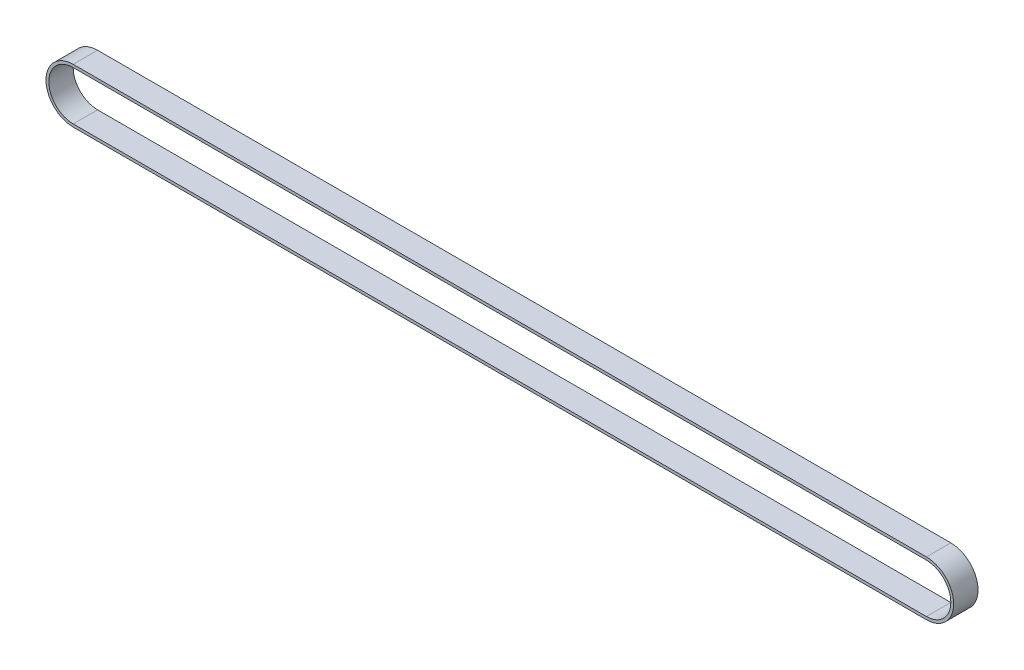
ISO-10303-21;
HEADER;
FILE_DESCRIPTION(('STEP AP214'),'2;1');
FILE_NAME('part.step','',(''),(''),'','','');
FILE_SCHEMA(('AUTOMOTIVE_DESIGN { 1 0 10303 214 1 1 1 1 }'));
ENDSEC;
DATA;
#1=APPLICATION_CONTEXT('core data for automotive mechanical design processes');
#2=APPLICATION_PROTOCOL_DEFINITION('international standard','automotive_design',2000,#1);
#3=PRODUCT_CONTEXT('',#1,'mechanical');
#4=PRODUCT('Part','Part','',(#3));
#5=PRODUCT_RELATED_PRODUCT_CATEGORY('part','',(#4));
#6=PRODUCT_DEFINITION_FORMATION('','',#4);
#7=PRODUCT_DEFINITION_CONTEXT('part definition',#1,'design');
#8=PRODUCT_DEFINITION('design','',#6,#7);
#9=PRODUCT_DEFINITION_SHAPE('','',#8);
#10=(LENGTH_UNIT() NAMED_UNIT(*) SI_UNIT(.MILLI.,.METRE.));
#11=(NAMED_UNIT(*) PLANE_ANGLE_UNIT() SI_UNIT($,.RADIAN.));
#12=(NAMED_UNIT(*) SI_UNIT($,.STERADIAN.) SOLID_ANGLE_UNIT());
#13=UNCERTAINTY_MEASURE_WITH_UNIT(LENGTH_MEASURE(1.E-05),#10,'distance_accuracy_value','');
#14=(GEOMETRIC_REPRESENTATION_CONTEXT(3) GLOBAL_UNCERTAINTY_ASSIGNED_CONTEXT((#13)) GLOBAL_UNIT_ASSIGNED_CONTEXT((#10,
#11,#12)) REPRESENTATION_CONTEXT('',''));
#15=CARTESIAN_POINT('',(0.,0.,0.));
#16=DIRECTION('',(0.,0.,1.));
#17=DIRECTION('',(1.,0.,0.));
#18=AXIS2_PLACEMENT_3D('',#15,#16,#17);
#19=CARTESIAN_POINT('',(0.,0.,40.));
#20=DIRECTION('',(0.,0.,1.));
#21=DIRECTION('',(1.,0.,0.));
#22=AXIS2_PLACEMENT_3D('',#19,#20,#21);
#23=PLANE('',#22);
#24=CARTESIAN_POINT('',(0.,0.,40.));
#25=DIRECTION('',(0.,0.,1.));
#26=DIRECTION('',(1.,0.,0.));
#27=AXIS2_PLACEMENT_3D('',#24,#25,#26);
#28=CIRCLE('',#27,44.6549999999999);
#29=CARTESIAN_POINT('',(0.,44.6549999999998,40.));
#30=VERTEX_POINT('',#29);
#31=CARTESIAN_POINT('',(0.,-44.655,40.));
#32=VERTEX_POINT('',#31);
#33=EDGE_CURVE('E133',#30,#32,#28,.T.);
#34=ORIENTED_EDGE('',*,*,#33,.T.);
#35=DIRECTION('',(1.,0.,0.));
#36=VECTOR('',#35,1.);
#37=CARTESIAN_POINT('',(0.,-44.655,40.));
#38=LINE('',#37,#36);
#39=CARTESIAN_POINT('',(1400.,-44.655,40.));
#40=VERTEX_POINT('',#39);
#41=EDGE_CURVE('E136',#32,#40,#38,.T.);
#42=ORIENTED_EDGE('',*,*,#41,.T.);
#43=CARTESIAN_POINT('',(1400.,0.,40.));
#44=DIRECTION('',(0.,0.,1.));
#45=DIRECTION('',(1.,0.,0.));
#46=AXIS2_PLACEMENT_3D('',#43,#44,#45);
#47=CIRCLE('',#46,44.655);
#48=CARTESIAN_POINT('',(1400.,44.655,40.));
#49=VERTEX_POINT('',#48);
#50=EDGE_CURVE('E139',#40,#49,#47,.T.);
#51=ORIENTED_EDGE('',*,*,#50,.T.);
#52=DIRECTION('',(-1.,0.,0.));
#53=VECTOR('',#52,1.);
#54=CARTESIAN_POINT('',(1400.,44.655,40.));
#55=LINE('',#54,#53);
#56=EDGE_CURVE('E141',#49,#30,#55,.T.);
#57=ORIENTED_EDGE('',*,*,#56,.T.);
#58=EDGE_LOOP('',(#34,#42,#51,#57));
#59=FACE_BOUND('',#58,.T.);
#60=DIRECTION('',(-1.,0.,0.));
#61=VECTOR('',#60,1.);
#62=CARTESIAN_POINT('',(0.,40.055,40.));
#63=LINE('',#62,#61);
#64=CARTESIAN_POINT('',(1400.,40.055,40.));
#65=VERTEX_POINT('',#64);
#66=CARTESIAN_POINT('',(0.,40.055,40.));
#67=VERTEX_POINT('',#66);
#68=EDGE_CURVE('E105',#65,#67,#63,.T.);
#69=ORIENTED_EDGE('',*,*,#68,.F.);
#70=CARTESIAN_POINT('',(1400.,0.,40.));
#71=DIRECTION('',(0.,0.,1.));
#72=DIRECTION('',(-1.,0.,0.));
#73=AXIS2_PLACEMENT_3D('',#70,#71,#72);
#74=CIRCLE('',#73,40.0549999999999);
#75=CARTESIAN_POINT('',(1400.,-40.0549999999998,40.));
#76=VERTEX_POINT('',#75);
#77=EDGE_CURVE('E97',#76,#65,#74,.T.);
#78=ORIENTED_EDGE('',*,*,#77,.F.);
#79=DIRECTION('',(1.,0.,0.));
#80=VECTOR('',#79,1.);
#81=CARTESIAN_POINT('',(1400.,-40.0549999999998,40.));
#82=LINE('',#81,#80);
#83=CARTESIAN_POINT('',(0.,-40.055,40.));
#84=VERTEX_POINT('',#83);
#85=EDGE_CURVE('E119',#84,#76,#82,.T.);
#86=ORIENTED_EDGE('',*,*,#85,.F.);
#87=CARTESIAN_POINT('',(0.,0.,40.));
#88=DIRECTION('',(0.,0.,1.));
#89=DIRECTION('',(-1.,0.,0.));
#90=AXIS2_PLACEMENT_3D('',#87,#88,#89);
#91=CIRCLE('',#90,40.055);
#92=EDGE_CURVE('E117',#67,#84,#91,.T.);
#93=ORIENTED_EDGE('',*,*,#92,.F.);
#94=EDGE_LOOP('',(#69,#78,#86,#93));
#95=FACE_BOUND('',#94,.T.);
#96=ADVANCED_FACE('F32',(#59,#95),#23,.T.);
#97=CARTESIAN_POINT('',(0.,0.,0.));
#98=DIRECTION('',(0.,0.,1.));
#99=DIRECTION('',(1.,0.,0.));
#100=AXIS2_PLACEMENT_3D('',#97,#98,#99);
#101=PLANE('',#100);
#102=CARTESIAN_POINT('',(0.,0.,0.));
#103=DIRECTION('',(0.,0.,1.));
#104=DIRECTION('',(1.,0.,0.));
#105=AXIS2_PLACEMENT_3D('',#102,#103,#104);
#106=CIRCLE('',#105,44.6549999999999);
#107=CARTESIAN_POINT('',(0.,44.6549999999998,0.));
#108=VERTEX_POINT('',#107);
#109=CARTESIAN_POINT('',(0.,-44.655,0.));
#110=VERTEX_POINT('',#109);
#111=EDGE_CURVE('E113',#108,#110,#106,.T.);
#112=ORIENTED_EDGE('',*,*,#111,.F.);
#113=DIRECTION('',(-1.,0.,0.));
#114=VECTOR('',#113,1.);
#115=CARTESIAN_POINT('',(1400.,44.655,0.));
#116=LINE('',#115,#114);
#117=CARTESIAN_POINT('',(1400.,44.655,0.));
#118=VERTEX_POINT('',#117);
#119=EDGE_CURVE('E137',#118,#108,#116,.T.);
#120=ORIENTED_EDGE('',*,*,#119,.F.);
#121=CARTESIAN_POINT('',(1400.,0.,0.));
#122=DIRECTION('',(0.,0.,1.));
#123=DIRECTION('',(1.,0.,0.));
#124=AXIS2_PLACEMENT_3D('',#121,#122,#123);
#125=CIRCLE('',#124,44.655);
#126=CARTESIAN_POINT('',(1400.,-44.655,0.));
#127=VERTEX_POINT('',#126);
#128=EDGE_CURVE('E148',#127,#118,#125,.T.);
#129=ORIENTED_EDGE('',*,*,#128,.F.);
#130=DIRECTION('',(1.,0.,0.));
#131=VECTOR('',#130,1.);
#132=CARTESIAN_POINT('',(0.,-44.655,0.));
#133=LINE('',#132,#131);
#134=EDGE_CURVE('E146',#110,#127,#133,.T.);
#135=ORIENTED_EDGE('',*,*,#134,.F.);
#136=EDGE_LOOP('',(#112,#120,#129,#135));
#137=FACE_BOUND('',#136,.T.);
#138=CARTESIAN_POINT('',(1400.,0.,0.));
#139=DIRECTION('',(0.,0.,1.));
#140=DIRECTION('',(-1.,0.,0.));
#141=AXIS2_PLACEMENT_3D('',#138,#139,#140);
#142=CIRCLE('',#141,40.0549999999999);
#143=CARTESIAN_POINT('',(1400.,-40.0549999999998,0.));
#144=VERTEX_POINT('',#143);
#145=CARTESIAN_POINT('',(1400.,40.055,0.));
#146=VERTEX_POINT('',#145);
#147=EDGE_CURVE('E55',#144,#146,#142,.T.);
#148=ORIENTED_EDGE('',*,*,#147,.T.);
#149=DIRECTION('',(-1.,0.,0.));
#150=VECTOR('',#149,1.);
#151=CARTESIAN_POINT('',(0.,40.055,0.));
#152=LINE('',#151,#150);
#153=CARTESIAN_POINT('',(0.,40.055,0.));
#154=VERTEX_POINT('',#153);
#155=EDGE_CURVE('E112',#146,#154,#152,.T.);
#156=ORIENTED_EDGE('',*,*,#155,.T.);
#157=CARTESIAN_POINT('',(0.,0.,0.));
#158=DIRECTION('',(0.,0.,1.));
#159=DIRECTION('',(-1.,0.,0.));
#160=AXIS2_PLACEMENT_3D('',#157,#158,#159);
#161=CIRCLE('',#160,40.055);
#162=CARTESIAN_POINT('',(0.,-40.055,0.));
#163=VERTEX_POINT('',#162);
#164=EDGE_CURVE('E125',#154,#163,#161,.T.);
#165=ORIENTED_EDGE('',*,*,#164,.T.);
#166=DIRECTION('',(1.,0.,0.));
#167=VECTOR('',#166,1.);
#168=CARTESIAN_POINT('',(1400.,-40.0549999999998,0.));
#169=LINE('',#168,#167);
#170=EDGE_CURVE('E106',#163,#144,#169,.T.);
#171=ORIENTED_EDGE('',*,*,#170,.T.);
#172=EDGE_LOOP('',(#148,#156,#165,#171));
#173=FACE_BOUND('',#172,.T.);
#174=ADVANCED_FACE('F166',(#137,#173),#101,.F.);
#175=CARTESIAN_POINT('',(0.,0.,40.));
#176=DIRECTION('',(0.,0.,-1.));
#177=DIRECTION('',(-1.,0.,0.));
#178=AXIS2_PLACEMENT_3D('',#175,#176,#177);
#179=CYLINDRICAL_SURFACE('',#178,44.6549999999999);
#180=ORIENTED_EDGE('',*,*,#111,.T.);
#181=DIRECTION('',(0.,0.,-1.));
#182=VECTOR('',#181,1.);
#183=CARTESIAN_POINT('',(0.,-44.655,40.));
#184=LINE('',#183,#182);
#185=EDGE_CURVE('E11',#32,#110,#184,.T.);
#186=ORIENTED_EDGE('',*,*,#185,.F.);
#187=ORIENTED_EDGE('',*,*,#33,.F.);
#188=DIRECTION('',(0.,0.,-1.));
#189=VECTOR('',#188,1.);
#190=CARTESIAN_POINT('',(0.,44.6549999999998,40.));
#191=LINE('',#190,#189);
#192=EDGE_CURVE('E143',#30,#108,#191,.T.);
#193=ORIENTED_EDGE('',*,*,#192,.T.);
#194=EDGE_LOOP('',(#180,#186,#187,#193));
#195=FACE_BOUND('',#194,.T.);
#196=ADVANCED_FACE('F34',(#195),#179,.T.);
#197=CARTESIAN_POINT('',(0.,-44.655,40.));
#198=DIRECTION('',(0.,1.,0.));
#199=DIRECTION('',(0.,0.,1.));
#200=AXIS2_PLACEMENT_3D('',#197,#198,#199);
#201=PLANE('',#200);
#202=ORIENTED_EDGE('',*,*,#134,.T.);
#203=DIRECTION('',(0.,0.,-1.));
#204=VECTOR('',#203,1.);
#205=CARTESIAN_POINT('',(1400.,-44.655,40.));
#206=LINE('',#205,#204);
#207=EDGE_CURVE('E40',#40,#127,#206,.T.);
#208=ORIENTED_EDGE('',*,*,#207,.F.);
#209=ORIENTED_EDGE('',*,*,#41,.F.);
#210=ORIENTED_EDGE('',*,*,#185,.T.);
#211=EDGE_LOOP('',(#202,#208,#209,#210));
#212=FACE_BOUND('',#211,.T.);
#213=ADVANCED_FACE('F176',(#212),#201,.F.);
#214=CARTESIAN_POINT('',(1400.,0.,40.));
#215=DIRECTION('',(0.,0.,-1.));
#216=DIRECTION('',(-1.,0.,0.));
#217=AXIS2_PLACEMENT_3D('',#214,#215,#216);
#218=CYLINDRICAL_SURFACE('',#217,44.655);
#219=ORIENTED_EDGE('',*,*,#128,.T.);
#220=DIRECTION('',(0.,0.,-1.));
#221=VECTOR('',#220,1.);
#222=CARTESIAN_POINT('',(1400.,44.655,40.));
#223=LINE('',#222,#221);
#224=EDGE_CURVE('E153',#49,#118,#223,.T.);
#225=ORIENTED_EDGE('',*,*,#224,.F.);
#226=ORIENTED_EDGE('',*,*,#50,.F.);
#227=ORIENTED_EDGE('',*,*,#207,.T.);
#228=EDGE_LOOP('',(#219,#225,#226,#227));
#229=FACE_BOUND('',#228,.T.);
#230=ADVANCED_FACE('F160',(#229),#218,.T.);
#231=CARTESIAN_POINT('',(1400.,44.655,40.));
#232=DIRECTION('',(0.,-1.,0.));
#233=DIRECTION('',(1.,0.,0.));
#234=AXIS2_PLACEMENT_3D('',#231,#232,#233);
#235=PLANE('',#234);
#236=ORIENTED_EDGE('',*,*,#119,.T.);
#237=ORIENTED_EDGE('',*,*,#192,.F.);
#238=ORIENTED_EDGE('',*,*,#56,.F.);
#239=ORIENTED_EDGE('',*,*,#224,.T.);
#240=EDGE_LOOP('',(#236,#237,#238,#239));
#241=FACE_BOUND('',#240,.T.);
#242=ADVANCED_FACE('F170',(#241),#235,.F.);
#243=CARTESIAN_POINT('',(1400.,0.,40.));
#244=DIRECTION('',(0.,0.,-1.));
#245=DIRECTION('',(-1.,0.,0.));
#246=AXIS2_PLACEMENT_3D('',#243,#244,#245);
#247=CYLINDRICAL_SURFACE('',#246,40.0549999999999);
#248=ORIENTED_EDGE('',*,*,#147,.F.);
#249=DIRECTION('',(0.,0.,-1.));
#250=VECTOR('',#249,1.);
#251=CARTESIAN_POINT('',(1400.,-40.0549999999998,40.));
#252=LINE('',#251,#250);
#253=EDGE_CURVE('E101',#76,#144,#252,.T.);
#254=ORIENTED_EDGE('',*,*,#253,.F.);
#255=ORIENTED_EDGE('',*,*,#77,.T.);
#256=DIRECTION('',(0.,0.,-1.));
#257=VECTOR('',#256,1.);
#258=CARTESIAN_POINT('',(1400.,40.055,40.));
#259=LINE('',#258,#257);
#260=EDGE_CURVE('E100',#65,#146,#259,.T.);
#261=ORIENTED_EDGE('',*,*,#260,.T.);
#262=EDGE_LOOP('',(#248,#254,#255,#261));
#263=FACE_BOUND('',#262,.T.);
#264=ADVANCED_FACE('F99',(#263),#247,.F.);
#265=CARTESIAN_POINT('',(0.,40.055,40.));
#266=DIRECTION('',(0.,-1.,0.));
#267=DIRECTION('',(0.,0.,-1.));
#268=AXIS2_PLACEMENT_3D('',#265,#266,#267);
#269=PLANE('',#268);
#270=ORIENTED_EDGE('',*,*,#155,.F.);
#271=ORIENTED_EDGE('',*,*,#260,.F.);
#272=ORIENTED_EDGE('',*,*,#68,.T.);
#273=DIRECTION('',(0.,0.,-1.));
#274=VECTOR('',#273,1.);
#275=CARTESIAN_POINT('',(0.,40.055,40.));
#276=LINE('',#275,#274);
#277=EDGE_CURVE('E114',#67,#154,#276,.T.);
#278=ORIENTED_EDGE('',*,*,#277,.T.);
#279=EDGE_LOOP('',(#270,#271,#272,#278));
#280=FACE_BOUND('',#279,.T.);
#281=ADVANCED_FACE('F109',(#280),#269,.T.);
#282=CARTESIAN_POINT('',(0.,0.,40.));
#283=DIRECTION('',(0.,0.,-1.));
#284=DIRECTION('',(-1.,0.,0.));
#285=AXIS2_PLACEMENT_3D('',#282,#283,#284);
#286=CYLINDRICAL_SURFACE('',#285,40.055);
#287=ORIENTED_EDGE('',*,*,#164,.F.);
#288=ORIENTED_EDGE('',*,*,#277,.F.);
#289=ORIENTED_EDGE('',*,*,#92,.T.);
#290=DIRECTION('',(0.,0.,-1.));
#291=VECTOR('',#290,1.);
#292=CARTESIAN_POINT('',(0.,-40.055,40.));
#293=LINE('',#292,#291);
#294=EDGE_CURVE('E47',#84,#163,#293,.T.);
#295=ORIENTED_EDGE('',*,*,#294,.T.);
#296=EDGE_LOOP('',(#287,#288,#289,#295));
#297=FACE_BOUND('',#296,.T.);
#298=ADVANCED_FACE('F199',(#297),#286,.F.);
#299=CARTESIAN_POINT('',(1400.,-40.0549999999998,40.));
#300=DIRECTION('',(0.,1.,0.));
#301=DIRECTION('',(-1.,0.,0.));
#302=AXIS2_PLACEMENT_3D('',#299,#300,#301);
#303=PLANE('',#302);
#304=ORIENTED_EDGE('',*,*,#170,.F.);
#305=ORIENTED_EDGE('',*,*,#294,.F.);
#306=ORIENTED_EDGE('',*,*,#85,.T.);
#307=ORIENTED_EDGE('',*,*,#253,.T.);
#308=EDGE_LOOP('',(#304,#305,#306,#307));
#309=FACE_BOUND('',#308,.T.);
#310=ADVANCED_FACE('F203',(#309),#303,.T.);
#311=CLOSED_SHELL('',(#96,#174,#196,#213,#230,#242,#264,#281,#298,#310));
#312=MANIFOLD_SOLID_BREP('B2',#311);
#313=ADVANCED_BREP_SHAPE_REPRESENTATION('',(#18,#312),#14);
#314=SHAPE_DEFINITION_REPRESENTATION(#9,#313);
ENDSEC;
END-ISO-10303-21;
